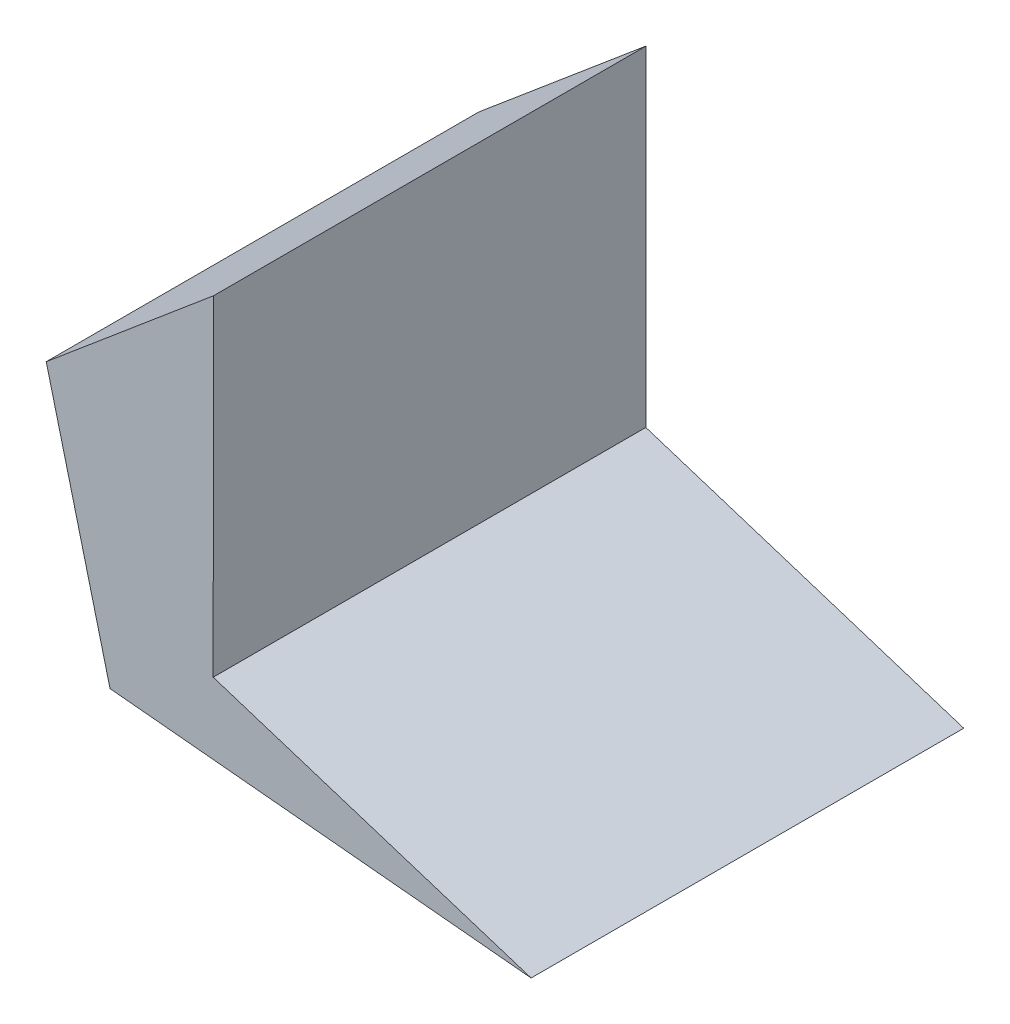
ISO-10303-21;
HEADER;
FILE_DESCRIPTION(('STEP AP214'),'2;1');
FILE_NAME('part.step','',(''),(''),'','','');
FILE_SCHEMA(('AUTOMOTIVE_DESIGN { 1 0 10303 214 1 1 1 1 }'));
ENDSEC;
DATA;
#1=APPLICATION_CONTEXT('core data for automotive mechanical design processes');
#2=APPLICATION_PROTOCOL_DEFINITION('international standard','automotive_design',2000,#1);
#3=PRODUCT_CONTEXT('',#1,'mechanical');
#4=PRODUCT('Part','Part','',(#3));
#5=PRODUCT_RELATED_PRODUCT_CATEGORY('part','',(#4));
#6=PRODUCT_DEFINITION_FORMATION('','',#4);
#7=PRODUCT_DEFINITION_CONTEXT('part definition',#1,'design');
#8=PRODUCT_DEFINITION('design','',#6,#7);
#9=PRODUCT_DEFINITION_SHAPE('','',#8);
#10=(LENGTH_UNIT() NAMED_UNIT(*) SI_UNIT(.MILLI.,.METRE.));
#11=(NAMED_UNIT(*) PLANE_ANGLE_UNIT() SI_UNIT($,.RADIAN.));
#12=(NAMED_UNIT(*) SI_UNIT($,.STERADIAN.) SOLID_ANGLE_UNIT());
#13=UNCERTAINTY_MEASURE_WITH_UNIT(LENGTH_MEASURE(1.E-05),#10,'distance_accuracy_value','');
#14=(GEOMETRIC_REPRESENTATION_CONTEXT(3) GLOBAL_UNCERTAINTY_ASSIGNED_CONTEXT((#13)) GLOBAL_UNIT_ASSIGNED_CONTEXT((#10,
#11,#12)) REPRESENTATION_CONTEXT('',''));
#15=CARTESIAN_POINT('',(0.,0.,0.));
#16=DIRECTION('',(0.,0.,1.));
#17=DIRECTION('',(1.,0.,0.));
#18=AXIS2_PLACEMENT_3D('',#15,#16,#17);
#19=CARTESIAN_POINT('',(-169.562304458751,-46.160309930931,15.5));
#20=DIRECTION('',(-0.304147973316343,-0.952624800394972,0.));
#21=DIRECTION('',(0.952624800394973,-0.304147973316343,0.));
#22=AXIS2_PLACEMENT_3D('',#19,#20,#21);
#23=PLANE('',#22);
#24=DIRECTION('',(-0.952624800394972,0.304147973316343,0.));
#25=VECTOR('',#24,1.);
#26=CARTESIAN_POINT('',(-169.562304458751,-46.160309930931,0.));
#27=LINE('',#26,#25);
#28=CARTESIAN_POINT('',(-158.172150746612,-49.7968855962634,0.));
#29=VERTEX_POINT('',#28);
#30=CARTESIAN_POINT('',(-169.562304458751,-46.160309930931,0.));
#31=VERTEX_POINT('',#30);
#32=EDGE_CURVE('E107',#29,#31,#27,.T.);
#33=ORIENTED_EDGE('',*,*,#32,.T.);
#34=DIRECTION('',(0.,0.,-1.));
#35=VECTOR('',#34,1.);
#36=CARTESIAN_POINT('',(-169.562304458751,-46.160309930931,15.5));
#37=LINE('',#36,#35);
#38=CARTESIAN_POINT('',(-169.562304458751,-46.160309930931,15.5));
#39=VERTEX_POINT('',#38);
#40=EDGE_CURVE('E11',#39,#31,#37,.T.);
#41=ORIENTED_EDGE('',*,*,#40,.F.);
#42=DIRECTION('',(-0.952624800394972,0.304147973316343,0.));
#43=VECTOR('',#42,1.);
#44=CARTESIAN_POINT('',(-169.562304458751,-46.160309930931,15.5));
#45=LINE('',#44,#43);
#46=CARTESIAN_POINT('',(-158.172150746612,-49.7968855962634,15.5));
#47=VERTEX_POINT('',#46);
#48=EDGE_CURVE('E115',#47,#39,#45,.T.);
#49=ORIENTED_EDGE('',*,*,#48,.F.);
#50=DIRECTION('',(0.,0.,-1.));
#51=VECTOR('',#50,1.);
#52=CARTESIAN_POINT('',(-158.172150746612,-49.7968855962634,15.5));
#53=LINE('',#52,#51);
#54=EDGE_CURVE('E103',#47,#29,#53,.T.);
#55=ORIENTED_EDGE('',*,*,#54,.T.);
#56=EDGE_LOOP('',(#33,#41,#49,#55));
#57=FACE_BOUND('',#56,.T.);
#58=ADVANCED_FACE('F33',(#57),#23,.F.);
#59=CARTESIAN_POINT('',(-169.552568547295,-34.3207649130277,15.5));
#60=DIRECTION('',(-0.999999661893914,0.000822321140619647,0.));
#61=DIRECTION('',(-0.000822321140619647,-0.999999661893914,0.));
#62=AXIS2_PLACEMENT_3D('',#59,#60,#61);
#63=PLANE('',#62);
#64=DIRECTION('',(0.000822321140619647,0.999999661893914,0.));
#65=VECTOR('',#64,1.);
#66=CARTESIAN_POINT('',(-169.552568547295,-34.3207649130277,0.));
#67=LINE('',#66,#65);
#68=CARTESIAN_POINT('',(-169.552568547295,-34.3207649130277,0.));
#69=VERTEX_POINT('',#68);
#70=EDGE_CURVE('E110',#31,#69,#67,.T.);
#71=ORIENTED_EDGE('',*,*,#70,.T.);
#72=DIRECTION('',(0.,0.,-1.));
#73=VECTOR('',#72,1.);
#74=CARTESIAN_POINT('',(-169.552568547295,-34.3207649130277,15.5));
#75=LINE('',#74,#73);
#76=CARTESIAN_POINT('',(-169.552568547295,-34.3207649130277,15.5));
#77=VERTEX_POINT('',#76);
#78=EDGE_CURVE('E41',#77,#69,#75,.T.);
#79=ORIENTED_EDGE('',*,*,#78,.F.);
#80=DIRECTION('',(0.000822321140619647,0.999999661893914,0.));
#81=VECTOR('',#80,1.);
#82=CARTESIAN_POINT('',(-169.552568547295,-34.3207649130277,15.5));
#83=LINE('',#82,#81);
#84=EDGE_CURVE('E83',#39,#77,#83,.T.);
#85=ORIENTED_EDGE('',*,*,#84,.F.);
#86=ORIENTED_EDGE('',*,*,#40,.T.);
#87=EDGE_LOOP('',(#71,#79,#85,#86));
#88=FACE_BOUND('',#87,.T.);
#89=ADVANCED_FACE('F134',(#88),#63,.F.);
#90=CARTESIAN_POINT('',(-175.543179907873,-39.3609129310978,15.5));
#91=DIRECTION('',(0.64379359292476,-0.765199196098002,0.));
#92=DIRECTION('',(0.765199196098002,0.64379359292476,0.));
#93=AXIS2_PLACEMENT_3D('',#90,#91,#92);
#94=PLANE('',#93);
#95=DIRECTION('',(-0.765199196098002,-0.64379359292476,0.));
#96=VECTOR('',#95,1.);
#97=CARTESIAN_POINT('',(-175.543179907873,-39.3609129310978,0.));
#98=LINE('',#97,#96);
#99=CARTESIAN_POINT('',(-175.543179907873,-39.3609129310978,0.));
#100=VERTEX_POINT('',#99);
#101=EDGE_CURVE('E98',#69,#100,#98,.T.);
#102=ORIENTED_EDGE('',*,*,#101,.T.);
#103=DIRECTION('',(0.,0.,-1.));
#104=VECTOR('',#103,1.);
#105=CARTESIAN_POINT('',(-175.543179907873,-39.3609129310978,15.5));
#106=LINE('',#105,#104);
#107=CARTESIAN_POINT('',(-175.543179907873,-39.3609129310978,15.5));
#108=VERTEX_POINT('',#107);
#109=EDGE_CURVE('E95',#108,#100,#106,.T.);
#110=ORIENTED_EDGE('',*,*,#109,.F.);
#111=DIRECTION('',(-0.765199196098002,-0.64379359292476,0.));
#112=VECTOR('',#111,1.);
#113=CARTESIAN_POINT('',(-175.543179907873,-39.3609129310978,15.5));
#114=LINE('',#113,#112);
#115=EDGE_CURVE('E87',#77,#108,#114,.T.);
#116=ORIENTED_EDGE('',*,*,#115,.F.);
#117=ORIENTED_EDGE('',*,*,#78,.T.);
#118=EDGE_LOOP('',(#102,#110,#116,#117));
#119=FACE_BOUND('',#118,.T.);
#120=ADVANCED_FACE('F96',(#119),#94,.F.);
#121=CARTESIAN_POINT('',(-173.257797227892,-48.3609879160647,15.5));
#122=DIRECTION('',(0.9692397779052,0.246118371777238,0.));
#123=DIRECTION('',(-0.246118371777238,0.9692397779052,0.));
#124=AXIS2_PLACEMENT_3D('',#121,#122,#123);
#125=PLANE('',#124);
#126=DIRECTION('',(0.246118371777238,-0.9692397779052,0.));
#127=VECTOR('',#126,1.);
#128=CARTESIAN_POINT('',(-173.257797227892,-48.3609879160647,0.));
#129=LINE('',#128,#127);
#130=CARTESIAN_POINT('',(-173.257797227892,-48.3609879160647,0.));
#131=VERTEX_POINT('',#130);
#132=EDGE_CURVE('E69',#100,#131,#129,.T.);
#133=ORIENTED_EDGE('',*,*,#132,.T.);
#134=DIRECTION('',(0.,0.,-1.));
#135=VECTOR('',#134,1.);
#136=CARTESIAN_POINT('',(-173.257797227892,-48.3609879160647,15.5));
#137=LINE('',#136,#135);
#138=CARTESIAN_POINT('',(-173.257797227892,-48.3609879160647,15.5));
#139=VERTEX_POINT('',#138);
#140=EDGE_CURVE('E99',#139,#131,#137,.T.);
#141=ORIENTED_EDGE('',*,*,#140,.F.);
#142=DIRECTION('',(0.246118371777238,-0.9692397779052,0.));
#143=VECTOR('',#142,1.);
#144=CARTESIAN_POINT('',(-173.257797227892,-48.3609879160647,15.5));
#145=LINE('',#144,#143);
#146=EDGE_CURVE('E91',#108,#139,#145,.T.);
#147=ORIENTED_EDGE('',*,*,#146,.F.);
#148=ORIENTED_EDGE('',*,*,#109,.T.);
#149=EDGE_LOOP('',(#133,#141,#147,#148));
#150=FACE_BOUND('',#149,.T.);
#151=ADVANCED_FACE('F101',(#150),#125,.F.);
#152=CARTESIAN_POINT('',(-158.172150746612,-49.7968855962634,15.5));
#153=DIRECTION('',(0.0947547768123798,0.995500644033562,0.));
#154=DIRECTION('',(-0.995500644033562,0.0947547768123799,0.));
#155=AXIS2_PLACEMENT_3D('',#152,#153,#154);
#156=PLANE('',#155);
#157=DIRECTION('',(0.995500644033562,-0.0947547768123798,0.));
#158=VECTOR('',#157,1.);
#159=CARTESIAN_POINT('',(-158.172150746612,-49.7968855962634,0.));
#160=LINE('',#159,#158);
#161=EDGE_CURVE('E75',#131,#29,#160,.T.);
#162=ORIENTED_EDGE('',*,*,#161,.T.);
#163=ORIENTED_EDGE('',*,*,#54,.F.);
#164=DIRECTION('',(0.995500644033562,-0.0947547768123798,0.));
#165=VECTOR('',#164,1.);
#166=CARTESIAN_POINT('',(-158.172150746612,-49.7968855962634,15.5));
#167=LINE('',#166,#165);
#168=EDGE_CURVE('E49',#139,#47,#167,.T.);
#169=ORIENTED_EDGE('',*,*,#168,.F.);
#170=ORIENTED_EDGE('',*,*,#140,.T.);
#171=EDGE_LOOP('',(#162,#163,#169,#170));
#172=FACE_BOUND('',#171,.T.);
#173=ADVANCED_FACE('F123',(#172),#156,.F.);
#174=CARTESIAN_POINT('',(0.,0.,15.5));
#175=DIRECTION('',(0.,0.,-1.));
#176=DIRECTION('',(-1.,0.,0.));
#177=AXIS2_PLACEMENT_3D('',#174,#175,#176);
#178=PLANE('',#177);
#179=ORIENTED_EDGE('',*,*,#48,.T.);
#180=ORIENTED_EDGE('',*,*,#84,.T.);
#181=ORIENTED_EDGE('',*,*,#115,.T.);
#182=ORIENTED_EDGE('',*,*,#146,.T.);
#183=ORIENTED_EDGE('',*,*,#168,.T.);
#184=EDGE_LOOP('',(#179,#180,#181,#182,#183));
#185=FACE_BOUND('',#184,.T.);
#186=ADVANCED_FACE('F89',(#185),#178,.F.);
#187=CARTESIAN_POINT('',(0.,0.,0.));
#188=DIRECTION('',(0.,0.,-1.));
#189=DIRECTION('',(-1.,0.,0.));
#190=AXIS2_PLACEMENT_3D('',#187,#188,#189);
#191=PLANE('',#190);
#192=ORIENTED_EDGE('',*,*,#32,.F.);
#193=ORIENTED_EDGE('',*,*,#161,.F.);
#194=ORIENTED_EDGE('',*,*,#132,.F.);
#195=ORIENTED_EDGE('',*,*,#101,.F.);
#196=ORIENTED_EDGE('',*,*,#70,.F.);
#197=EDGE_LOOP('',(#192,#193,#194,#195,#196));
#198=FACE_BOUND('',#197,.T.);
#199=ADVANCED_FACE('F119',(#198),#191,.T.);
#200=CLOSED_SHELL('',(#58,#89,#120,#151,#173,#186,#199));
#201=MANIFOLD_SOLID_BREP('B2',#200);
#202=ADVANCED_BREP_SHAPE_REPRESENTATION('',(#18,#201),#14);
#203=SHAPE_DEFINITION_REPRESENTATION(#9,#202);
ENDSEC;
END-ISO-10303-21;
